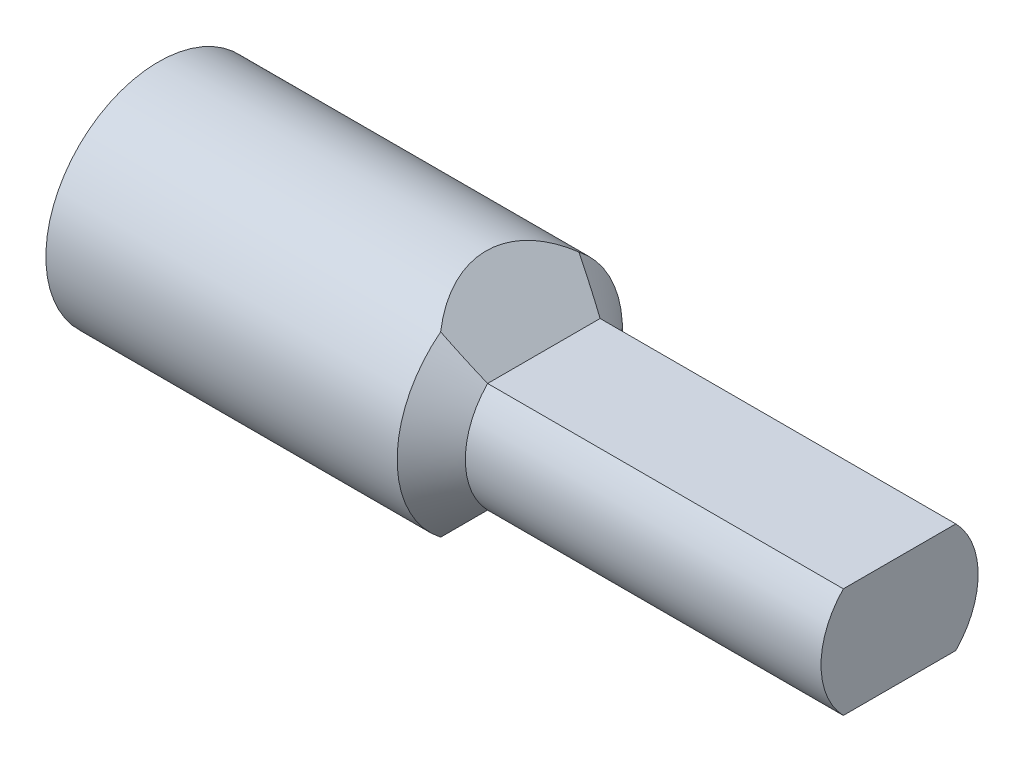
ISO-10303-21;
HEADER;
FILE_DESCRIPTION(('STEP AP214'),'2;1');
FILE_NAME('part.step','',(''),(''),'','','');
FILE_SCHEMA(('AUTOMOTIVE_DESIGN { 1 0 10303 214 1 1 1 1 }'));
ENDSEC;
DATA;
#1=APPLICATION_CONTEXT('core data for automotive mechanical design processes');
#2=APPLICATION_PROTOCOL_DEFINITION('international standard','automotive_design',2000,#1);
#3=PRODUCT_CONTEXT('',#1,'mechanical');
#4=PRODUCT('Part','Part','',(#3));
#5=PRODUCT_RELATED_PRODUCT_CATEGORY('part','',(#4));
#6=PRODUCT_DEFINITION_FORMATION('','',#4);
#7=PRODUCT_DEFINITION_CONTEXT('part definition',#1,'design');
#8=PRODUCT_DEFINITION('design','',#6,#7);
#9=PRODUCT_DEFINITION_SHAPE('','',#8);
#10=(LENGTH_UNIT() NAMED_UNIT(*) SI_UNIT(.MILLI.,.METRE.));
#11=(NAMED_UNIT(*) PLANE_ANGLE_UNIT() SI_UNIT($,.RADIAN.));
#12=(NAMED_UNIT(*) SI_UNIT($,.STERADIAN.) SOLID_ANGLE_UNIT());
#13=UNCERTAINTY_MEASURE_WITH_UNIT(LENGTH_MEASURE(1.E-05),#10,'distance_accuracy_value','');
#14=(GEOMETRIC_REPRESENTATION_CONTEXT(3) GLOBAL_UNCERTAINTY_ASSIGNED_CONTEXT((#13)) GLOBAL_UNIT_ASSIGNED_CONTEXT((#10,
#11,#12)) REPRESENTATION_CONTEXT('',''));
#15=CARTESIAN_POINT('',(0.,0.,0.));
#16=DIRECTION('',(0.,0.,1.));
#17=DIRECTION('',(1.,0.,0.));
#18=AXIS2_PLACEMENT_3D('',#15,#16,#17);
#19=CARTESIAN_POINT('',(2.,0.,0.));
#20=DIRECTION('',(-1.,0.,0.));
#21=DIRECTION('',(0.,0.,1.));
#22=AXIS2_PLACEMENT_3D('',#19,#20,#21);
#23=CYLINDRICAL_SURFACE('',#22,2.3);
#24=DIRECTION('',(-1.,0.,0.));
#25=VECTOR('',#24,1.);
#26=CARTESIAN_POINT('',(2.,1.54919333848297,-1.7));
#27=LINE('',#26,#25);
#28=CARTESIAN_POINT('',(-0.999999999999998,1.54919333848297,-1.7));
#29=VERTEX_POINT('',#28);
#30=CARTESIAN_POINT('',(-9.,1.54919333848297,-1.7));
#31=VERTEX_POINT('',#30);
#32=EDGE_CURVE('E114',#29,#31,#27,.T.);
#33=ORIENTED_EDGE('',*,*,#32,.F.);
#34=CARTESIAN_POINT('',(-0.999999999999998,0.,0.));
#35=DIRECTION('',(1.,0.,0.));
#36=DIRECTION('',(0.,0.,-1.));
#37=AXIS2_PLACEMENT_3D('',#34,#35,#36);
#38=CIRCLE('',#37,2.3);
#39=CARTESIAN_POINT('',(-0.999999999999998,-1.54919333848297,-1.7));
#40=VERTEX_POINT('',#39);
#41=EDGE_CURVE('E50',#29,#40,#38,.T.);
#42=ORIENTED_EDGE('',*,*,#41,.T.);
#43=DIRECTION('',(-1.,0.,0.));
#44=VECTOR('',#43,1.);
#45=CARTESIAN_POINT('',(2.,-1.54919333848297,-1.7));
#46=LINE('',#45,#44);
#47=CARTESIAN_POINT('',(-9.,-1.54919333848297,-1.7));
#48=VERTEX_POINT('',#47);
#49=EDGE_CURVE('E107',#40,#48,#46,.T.);
#50=ORIENTED_EDGE('',*,*,#49,.T.);
#51=CARTESIAN_POINT('',(-9.,0.,0.));
#52=DIRECTION('',(1.,0.,0.));
#53=DIRECTION('',(0.,0.,-1.));
#54=AXIS2_PLACEMENT_3D('',#51,#52,#53);
#55=CIRCLE('',#54,2.3);
#56=EDGE_CURVE('E110',#31,#48,#55,.T.);
#57=ORIENTED_EDGE('',*,*,#56,.F.);
#58=EDGE_LOOP('',(#33,#42,#50,#57));
#59=FACE_BOUND('',#58,.T.);
#60=ADVANCED_FACE('F35',(#59),#23,.F.);
#61=CARTESIAN_POINT('',(16.,0.,0.));
#62=DIRECTION('',(-1.,0.,0.));
#63=DIRECTION('',(0.,0.,1.));
#64=AXIS2_PLACEMENT_3D('',#61,#62,#63);
#65=CYLINDRICAL_SURFACE('',#64,2.65);
#66=DIRECTION('',(-1.,0.,0.));
#67=VECTOR('',#66,1.);
#68=CARTESIAN_POINT('',(16.,1.85,1.89736659610103));
#69=LINE('',#68,#67);
#70=CARTESIAN_POINT('',(16.,1.85,1.89736659610103));
#71=VERTEX_POINT('',#70);
#72=CARTESIAN_POINT('',(4.00000000000003,1.85,1.89736659610103));
#73=VERTEX_POINT('',#72);
#74=EDGE_CURVE('E140',#71,#73,#69,.T.);
#75=ORIENTED_EDGE('',*,*,#74,.T.);
#76=CARTESIAN_POINT('',(4.00000000000003,0.,0.));
#77=DIRECTION('',(1.,0.,0.));
#78=DIRECTION('',(0.,0.,-1.));
#79=AXIS2_PLACEMENT_3D('',#76,#77,#78);
#80=CIRCLE('',#79,2.65);
#81=CARTESIAN_POINT('',(4.00000000000003,-1.85,1.89736659610103));
#82=VERTEX_POINT('',#81);
#83=EDGE_CURVE('E157',#73,#82,#80,.T.);
#84=ORIENTED_EDGE('',*,*,#83,.T.);
#85=DIRECTION('',(-1.,0.,0.));
#86=VECTOR('',#85,1.);
#87=CARTESIAN_POINT('',(16.,-1.85,1.89736659610103));
#88=LINE('',#87,#86);
#89=CARTESIAN_POINT('',(16.,-1.85,1.89736659610103));
#90=VERTEX_POINT('',#89);
#91=EDGE_CURVE('E149',#90,#82,#88,.T.);
#92=ORIENTED_EDGE('',*,*,#91,.F.);
#93=CARTESIAN_POINT('',(16.,0.,0.));
#94=DIRECTION('',(1.,0.,0.));
#95=DIRECTION('',(0.,0.,-1.));
#96=AXIS2_PLACEMENT_3D('',#93,#94,#95);
#97=CIRCLE('',#96,2.65);
#98=EDGE_CURVE('E113',#71,#90,#97,.T.);
#99=ORIENTED_EDGE('',*,*,#98,.F.);
#100=EDGE_LOOP('',(#75,#84,#92,#99));
#101=FACE_BOUND('',#100,.T.);
#102=ADVANCED_FACE('F227',(#101),#65,.T.);
#103=CARTESIAN_POINT('',(16.,-1.85,1.89736659610103));
#104=DIRECTION('',(0.,1.,0.));
#105=DIRECTION('',(0.,0.,1.));
#106=AXIS2_PLACEMENT_3D('',#103,#104,#105);
#107=PLANE('',#106);
#108=ORIENTED_EDGE('',*,*,#91,.T.);
#109=DIRECTION('',(0.,0.,-1.));
#110=VECTOR('',#109,1.);
#111=CARTESIAN_POINT('',(4.00000000000003,-1.85,1.89736659610103));
#112=LINE('',#111,#110);
#113=CARTESIAN_POINT('',(4.00000000000003,-1.85,-1.89736659610103));
#114=VERTEX_POINT('',#113);
#115=EDGE_CURVE('E155',#82,#114,#112,.T.);
#116=ORIENTED_EDGE('',*,*,#115,.T.);
#117=DIRECTION('',(-1.,0.,0.));
#118=VECTOR('',#117,1.);
#119=CARTESIAN_POINT('',(16.,-1.85,-1.89736659610103));
#120=LINE('',#119,#118);
#121=CARTESIAN_POINT('',(16.,-1.85,-1.89736659610103));
#122=VERTEX_POINT('',#121);
#123=EDGE_CURVE('E146',#122,#114,#120,.T.);
#124=ORIENTED_EDGE('',*,*,#123,.F.);
#125=DIRECTION('',(0.,0.,-1.));
#126=VECTOR('',#125,1.);
#127=CARTESIAN_POINT('',(16.,-1.85,1.89736659610103));
#128=LINE('',#127,#126);
#129=EDGE_CURVE('E134',#90,#122,#128,.T.);
#130=ORIENTED_EDGE('',*,*,#129,.F.);
#131=EDGE_LOOP('',(#108,#116,#124,#130));
#132=FACE_BOUND('',#131,.T.);
#133=ADVANCED_FACE('F232',(#132),#107,.F.);
#134=CARTESIAN_POINT('',(16.,0.,0.));
#135=DIRECTION('',(-1.,0.,0.));
#136=DIRECTION('',(0.,0.,1.));
#137=AXIS2_PLACEMENT_3D('',#134,#135,#136);
#138=CYLINDRICAL_SURFACE('',#137,2.65);
#139=ORIENTED_EDGE('',*,*,#123,.T.);
#140=CARTESIAN_POINT('',(4.00000000000003,0.,0.));
#141=DIRECTION('',(1.,0.,0.));
#142=DIRECTION('',(0.,0.,-1.));
#143=AXIS2_PLACEMENT_3D('',#140,#141,#142);
#144=CIRCLE('',#143,2.65);
#145=CARTESIAN_POINT('',(4.00000000000003,1.85,-1.89736659610103));
#146=VERTEX_POINT('',#145);
#147=EDGE_CURVE('E152',#114,#146,#144,.T.);
#148=ORIENTED_EDGE('',*,*,#147,.T.);
#149=DIRECTION('',(-1.,0.,0.));
#150=VECTOR('',#149,1.);
#151=CARTESIAN_POINT('',(16.,1.85,-1.89736659610103));
#152=LINE('',#151,#150);
#153=CARTESIAN_POINT('',(16.,1.85,-1.89736659610103));
#154=VERTEX_POINT('',#153);
#155=EDGE_CURVE('E143',#154,#146,#152,.T.);
#156=ORIENTED_EDGE('',*,*,#155,.F.);
#157=CARTESIAN_POINT('',(16.,0.,0.));
#158=DIRECTION('',(1.,0.,0.));
#159=DIRECTION('',(0.,0.,-1.));
#160=AXIS2_PLACEMENT_3D('',#157,#158,#159);
#161=CIRCLE('',#160,2.65);
#162=EDGE_CURVE('E136',#122,#154,#161,.T.);
#163=ORIENTED_EDGE('',*,*,#162,.F.);
#164=EDGE_LOOP('',(#139,#148,#156,#163));
#165=FACE_BOUND('',#164,.T.);
#166=ADVANCED_FACE('F250',(#165),#138,.T.);
#167=CARTESIAN_POINT('',(16.,1.85,1.89736659610103));
#168=DIRECTION('',(0.,-1.,0.));
#169=DIRECTION('',(0.,0.,-1.));
#170=AXIS2_PLACEMENT_3D('',#167,#168,#169);
#171=PLANE('',#170);
#172=ORIENTED_EDGE('',*,*,#155,.T.);
#173=DIRECTION('',(0.,0.,1.));
#174=VECTOR('',#173,1.);
#175=CARTESIAN_POINT('',(4.00000000000003,1.85,1.89736659610103));
#176=LINE('',#175,#174);
#177=EDGE_CURVE('E159',#146,#73,#176,.T.);
#178=ORIENTED_EDGE('',*,*,#177,.T.);
#179=ORIENTED_EDGE('',*,*,#74,.F.);
#180=DIRECTION('',(0.,0.,1.));
#181=VECTOR('',#180,1.);
#182=CARTESIAN_POINT('',(16.,1.85,1.89736659610103));
#183=LINE('',#182,#181);
#184=EDGE_CURVE('E138',#154,#71,#183,.T.);
#185=ORIENTED_EDGE('',*,*,#184,.F.);
#186=EDGE_LOOP('',(#172,#178,#179,#185));
#187=FACE_BOUND('',#186,.T.);
#188=ADVANCED_FACE('F243',(#187),#171,.F.);
#189=CARTESIAN_POINT('',(16.,0.,0.));
#190=DIRECTION('',(1.,0.,0.));
#191=DIRECTION('',(0.,0.,-1.));
#192=AXIS2_PLACEMENT_3D('',#189,#190,#191);
#193=PLANE('',#192);
#194=ORIENTED_EDGE('',*,*,#98,.T.);
#195=ORIENTED_EDGE('',*,*,#129,.T.);
#196=ORIENTED_EDGE('',*,*,#162,.T.);
#197=ORIENTED_EDGE('',*,*,#184,.T.);
#198=EDGE_LOOP('',(#194,#195,#196,#197));
#199=FACE_BOUND('',#198,.T.);
#200=ADVANCED_FACE('F239',(#199),#193,.T.);
#201=CARTESIAN_POINT('',(0.,0.,0.));
#202=DIRECTION('',(1.,0.,0.));
#203=DIRECTION('',(0.,0.,-1.));
#204=AXIS2_PLACEMENT_3D('',#201,#202,#203);
#205=PLANE('',#204);
#206=CARTESIAN_POINT('',(0.,0.,0.));
#207=DIRECTION('',(1.,0.,0.));
#208=DIRECTION('',(0.,0.,-1.));
#209=AXIS2_PLACEMENT_3D('',#206,#207,#208);
#210=CIRCLE('',#209,1.29999999999999);
#211=CARTESIAN_POINT('',(0.,-0.875631017403411,-0.960869565217386));
#212=VERTEX_POINT('',#211);
#213=EDGE_CURVE('E55',#212,#212,#210,.F.);
#214=ORIENTED_EDGE('',*,*,#213,.T.);
#215=EDGE_LOOP('',(#214));
#216=FACE_BOUND('',#215,.T.);
#217=ADVANCED_FACE('F242',(#216),#205,.F.);
#218=CARTESIAN_POINT('',(2.,1.54919333848297,-1.7));
#219=DIRECTION('',(0.,0.,1.));
#220=DIRECTION('',(1.,0.,0.));
#221=AXIS2_PLACEMENT_3D('',#218,#219,#220);
#222=PLANE('',#221);
#223=ORIENTED_EDGE('',*,*,#49,.F.);
#224=CARTESIAN_POINT('',(-0.999999999999998,-1.54919333848297,-1.7));
#225=CARTESIAN_POINT('',(-0.974520977293433,-1.51136094456305,-1.7));
#226=CARTESIAN_POINT('',(-0.949387870382328,-1.47329595075994,-1.7));
#227=CARTESIAN_POINT('',(-0.899933936175087,-1.39662818421715,-1.7));
#228=CARTESIAN_POINT('',(-0.875613326454821,-1.35802527129011,-1.7));
#229=CARTESIAN_POINT('',(-0.803803962241551,-1.24089531646587,-1.7));
#230=CARTESIAN_POINT('',(-0.757756071547772,-1.16146952865761,-1.7));
#231=CARTESIAN_POINT('',(-0.669586365919587,-0.997116208388425,-1.7));
#232=CARTESIAN_POINT('',(-0.627639100669975,-0.912093850193668,-1.7));
#233=CARTESIAN_POINT('',(-0.551888646805159,-0.738612095282731,-1.7));
#234=CARTESIAN_POINT('',(-0.518066142944979,-0.65016144255061,-1.7));
#235=CARTESIAN_POINT('',(-0.473906899179682,-0.509003982034217,-1.7));
#236=CARTESIAN_POINT('',(-0.459754704015474,-0.457491146068599,-1.7));
#237=CARTESIAN_POINT('',(-0.435623707325159,-0.353477557879018,-1.7));
#238=CARTESIAN_POINT('',(-0.425645045813505,-0.30097677257289,-1.7));
#239=CARTESIAN_POINT('',(-0.410484455281287,-0.196000588030785,-1.7));
#240=CARTESIAN_POINT('',(-0.405239644535281,-0.143534397277221,-1.7));
#241=CARTESIAN_POINT('',(-0.39962136897463,-0.0383406189179161,-1.7));
#242=CARTESIAN_POINT('',(-0.399247561877825,0.0143869500604749,-1.7));
#243=CARTESIAN_POINT('',(-0.403392583518891,0.119627820769399,-1.7));
#244=CARTESIAN_POINT('',(-0.407909725176492,0.172141190115887,-1.7));
#245=CARTESIAN_POINT('',(-0.421570878566131,0.276564963933533,-1.7));
#246=CARTESIAN_POINT('',(-0.430716006530095,0.328475219847401,-1.7));
#247=CARTESIAN_POINT('',(-0.45333240412641,0.432178472358417,-1.7));
#248=CARTESIAN_POINT('',(-0.466868692285845,0.483957111387176,-1.7));
#249=CARTESIAN_POINT('',(-0.497625973142682,0.586380322897711,-1.7));
#250=CARTESIAN_POINT('',(-0.514846388549681,0.637025071684426,-1.7));
#251=CARTESIAN_POINT('',(-0.580414547710599,0.81205738896499,-1.7));
#252=CARTESIAN_POINT('',(-0.636796359574814,0.933447728375589,-1.7));
#253=CARTESIAN_POINT('',(-0.730159599562794,1.11088465057442,-1.7));
#254=CARTESIAN_POINT('',(-0.762825193304183,1.16937573375619,-1.7));
#255=CARTESIAN_POINT('',(-0.830494217626738,1.28499336648952,-1.7));
#256=CARTESIAN_POINT('',(-0.865497166522561,1.34212019391446,-1.7));
#257=CARTESIAN_POINT('',(-0.935409440232955,1.45215694577071,-1.7));
#258=CARTESIAN_POINT('',(-0.97022283554836,1.50512857164663,-1.7));
#259=CARTESIAN_POINT('',(-1.04118745466685,1.61017315772876,-1.7));
#260=CARTESIAN_POINT('',(-1.07733878113517,1.66224604851972,-1.7));
#261=CARTESIAN_POINT('',(-1.15041255614842,1.76517032959155,-1.7));
#262=CARTESIAN_POINT('',(-1.18732565863972,1.81602838292396,-1.7));
#263=CARTESIAN_POINT('',(-1.26203452211263,1.91707196994029,-1.7));
#264=CARTESIAN_POINT('',(-1.29983004730373,1.96725767776504,-1.7));
#265=CARTESIAN_POINT('',(-1.33798339668089,2.01716543723218,-1.7));
#266=B_SPLINE_CURVE_WITH_KNOTS('',3,(#224,#225,#226,#227,#228,#229,#230,#231,#232,#233,#234,
#235,#236,#237,#238,#239,#240,#241,#242,#243,#244,#245,#246,#247,#248,#249,#250,#251,#252,#253,
#254,#255,#256,#257,#258,#259,#260,#261,#262,#263,#264,#265),.UNSPECIFIED.,.F.,.F.,(4,2,2,2,2,2,
2,2,2,2,2,2,2,2,2,2,2,2,2,2,4),(0.,0.136832396488546,0.273701145842461,0.548971835667444,
0.833121644035026,1.11658909657102,1.2767105930548,1.43683746089237,1.5948045807902,
1.75276060038458,1.91066215209821,2.06860180652114,2.22899579460851,2.38936466787936,
2.78958913972749,2.9905637893885,3.19149714898217,3.38163932060344,3.57179611302847,
3.76031201162346,3.94877810106879),.UNSPECIFIED.);
#267=EDGE_CURVE('E11',#40,#29,#266,.T.);
#268=ORIENTED_EDGE('',*,*,#267,.T.);
#269=ORIENTED_EDGE('',*,*,#32,.T.);
#270=DIRECTION('',(0.,1.,0.));
#271=VECTOR('',#270,1.);
#272=CARTESIAN_POINT('',(-9.,1.54919333848297,-1.7));
#273=LINE('',#272,#271);
#274=EDGE_CURVE('E116',#48,#31,#273,.T.);
#275=ORIENTED_EDGE('',*,*,#274,.F.);
#276=EDGE_LOOP('',(#223,#268,#269,#275));
#277=FACE_BOUND('',#276,.T.);
#278=ADVANCED_FACE('F117',(#277),#222,.T.);
#279=CARTESIAN_POINT('',(2.,0.,0.));
#280=DIRECTION('',(-1.,0.,0.));
#281=DIRECTION('',(0.,0.,1.));
#282=AXIS2_PLACEMENT_3D('',#279,#280,#281);
#283=CYLINDRICAL_SURFACE('',#282,3.8);
#284=CARTESIAN_POINT('',(2.85000000000002,0.,0.));
#285=DIRECTION('',(-1.,0.,0.));
#286=DIRECTION('',(0.,0.,1.));
#287=AXIS2_PLACEMENT_3D('',#284,#285,#286);
#288=CIRCLE('',#287,3.8);
#289=CARTESIAN_POINT('',(2.85000000000002,-3.00000000000301,2.33238075793425));
#290=VERTEX_POINT('',#289);
#291=CARTESIAN_POINT('',(2.84999999999395,3.00000000000607,2.33238075793031));
#292=VERTEX_POINT('',#291);
#293=EDGE_CURVE('E166',#290,#292,#288,.T.);
#294=ORIENTED_EDGE('',*,*,#293,.T.);
#295=CARTESIAN_POINT('',(5.85000000000005,0.,0.));
#296=DIRECTION('',(-0.707106781186544,-0.707106781186551,0.));
#297=DIRECTION('',(-0.707106781186551,0.707106781186544,0.));
#298=AXIS2_PLACEMENT_3D('',#295,#296,#297);
#299=ELLIPSE('',#298,5.37401153701779,3.8);
#300=CARTESIAN_POINT('',(2.85000000000002,3.00000000000299,-2.33238075793428));
#301=VERTEX_POINT('',#300);
#302=EDGE_CURVE('E168',#292,#301,#299,.T.);
#303=ORIENTED_EDGE('',*,*,#302,.T.);
#304=CARTESIAN_POINT('',(2.85000000000002,0.,0.));
#305=DIRECTION('',(-1.,0.,0.));
#306=DIRECTION('',(0.,0.,1.));
#307=AXIS2_PLACEMENT_3D('',#304,#305,#306);
#308=CIRCLE('',#307,3.8);
#309=CARTESIAN_POINT('',(2.84999999999395,-3.00000000000607,-2.33238075793031));
#310=VERTEX_POINT('',#309);
#311=EDGE_CURVE('E161',#301,#310,#308,.T.);
#312=ORIENTED_EDGE('',*,*,#311,.T.);
#313=CARTESIAN_POINT('',(5.85000000000005,0.,0.));
#314=DIRECTION('',(-0.707106781186544,0.707106781186551,0.));
#315=DIRECTION('',(-0.707106781186551,-0.707106781186544,0.));
#316=AXIS2_PLACEMENT_3D('',#313,#314,#315);
#317=ELLIPSE('',#316,5.37401153701779,3.8);
#318=EDGE_CURVE('E164',#310,#290,#317,.T.);
#319=ORIENTED_EDGE('',*,*,#318,.T.);
#320=EDGE_LOOP('',(#294,#303,#312,#319));
#321=FACE_BOUND('',#320,.T.);
#322=CARTESIAN_POINT('',(-9.,0.,0.));
#323=DIRECTION('',(1.,0.,0.));
#324=DIRECTION('',(0.,0.,-1.));
#325=AXIS2_PLACEMENT_3D('',#322,#323,#324);
#326=CIRCLE('',#325,3.8);
#327=CARTESIAN_POINT('',(-9.,0.,-3.8));
#328=VERTEX_POINT('',#327);
#329=EDGE_CURVE('E119',#328,#328,#326,.T.);
#330=ORIENTED_EDGE('',*,*,#329,.T.);
#331=EDGE_LOOP('',(#330));
#332=FACE_BOUND('',#331,.T.);
#333=ADVANCED_FACE('F223',(#321,#332),#283,.T.);
#334=CARTESIAN_POINT('',(-9.,0.,0.));
#335=DIRECTION('',(1.,0.,0.));
#336=DIRECTION('',(0.,0.,-1.));
#337=AXIS2_PLACEMENT_3D('',#334,#335,#336);
#338=PLANE('',#337);
#339=ORIENTED_EDGE('',*,*,#274,.T.);
#340=ORIENTED_EDGE('',*,*,#56,.T.);
#341=EDGE_LOOP('',(#339,#340));
#342=FACE_BOUND('',#341,.T.);
#343=ORIENTED_EDGE('',*,*,#329,.F.);
#344=EDGE_LOOP('',(#343));
#345=FACE_BOUND('',#344,.T.);
#346=ADVANCED_FACE('F121',(#342,#345),#338,.F.);
#347=CARTESIAN_POINT('',(4.00000000000003,0.,0.));
#348=DIRECTION('',(-1.,0.,0.));
#349=DIRECTION('',(0.,0.,1.));
#350=AXIS2_PLACEMENT_3D('',#347,#348,#349);
#351=CONICAL_SURFACE('',#350,2.65,0.785398163397443);
#352=CARTESIAN_POINT('',(-4.91153301699797,10.7615330169979,4.22592626854714));
#353=CARTESIAN_POINT('',(-4.55081779517015,10.4008177951701,4.15761185207403));
#354=CARTESIAN_POINT('',(-4.19024796892505,10.040247968925,4.08772375748785));
#355=CARTESIAN_POINT('',(-3.46944608340027,9.31944608340022,3.94415155166097));
#356=CARTESIAN_POINT('',(-3.10921406613069,8.95921406613065,3.87046701924158));
#357=CARTESIAN_POINT('',(-2.38764354666603,8.237643546666,3.71833686549065));
#358=CARTESIAN_POINT('',(-2.02630707868424,7.87630707868421,3.63987186504859));
#359=CARTESIAN_POINT('',(-1.30426418083019,7.15426418083017,3.47755941518371));
#360=CARTESIAN_POINT('',(-0.943557705470605,6.79355770547059,3.39371237238774));
#361=CARTESIAN_POINT('',(-0.197405168471988,6.04740516847198,3.21318708841492));
#362=CARTESIAN_POINT('',(0.187982112190267,5.66201788780973,3.1160206121849));
#363=CARTESIAN_POINT('',(0.957552301137427,4.89244769886257,2.91177250887698));
#364=CARTESIAN_POINT('',(1.34173491477694,4.50826508522307,2.80468862609197));
#365=CARTESIAN_POINT('',(1.91608921030257,3.93391078969745,2.63390445648319));
#366=CARTESIAN_POINT('',(2.10702555360999,3.74297444639003,2.57534868790454));
#367=CARTESIAN_POINT('',(2.48823510288748,3.36176489711254,2.45408129075882));
#368=CARTESIAN_POINT('',(2.6785083300404,3.17149166995962,2.39136979624881));
#369=CARTESIAN_POINT('',(3.0581000699957,2.79189993000432,2.26081819659001));
#370=CARTESIAN_POINT('',(3.2474189171546,2.60258108284542,2.19298004323988));
#371=CARTESIAN_POINT('',(3.62480670371401,2.22519329628602,2.05070679791323));
#372=CARTESIAN_POINT('',(3.81287580039248,2.03712419960756,1.97627255361211));
#373=CARTESIAN_POINT('',(4.06572122719966,1.78427877280037,1.86965347095813));
#374=CARTESIAN_POINT('',(4.13132589805438,1.71867410194566,1.84138874441517));
#375=CARTESIAN_POINT('',(4.26225871268011,1.58774128731993,1.78359804910418));
#376=CARTESIAN_POINT('',(4.32758685021739,1.52241314978264,1.75407205206873));
#377=CARTESIAN_POINT('',(4.52316119592534,1.3268388040747,1.66331531503715));
#378=CARTESIAN_POINT('',(4.65291473839891,1.19708526160113,1.59994019411211));
#379=CARTESIAN_POINT('',(4.91025286007474,0.9397471399253,1.46565331321027));
#380=CARTESIAN_POINT('',(5.0378407625423,0.812159237457741,1.39475459812326));
#381=CARTESIAN_POINT('',(5.22665778295301,0.623342217047037,1.28014954924867));
#382=CARTESIAN_POINT('',(5.28914300322245,0.560856996777597,1.24059048344947));
#383=CARTESIAN_POINT('',(5.41295349323087,0.437046506769184,1.15801144576073));
#384=CARTESIAN_POINT('',(5.47427908135062,0.375720918649429,1.11499244136229));
#385=CARTESIAN_POINT('',(5.57264895002908,0.277351049970969,1.04142176279481));
#386=CARTESIAN_POINT('',(5.6101983501396,0.239801649860451,1.01222290917777));
#387=CARTESIAN_POINT('',(5.68445942880808,0.165540571191975,0.951725947657861));
#388=CARTESIAN_POINT('',(5.72117091228686,0.128829087713188,0.920427357454204));
#389=CARTESIAN_POINT('',(5.79323689472301,0.0567631052770428,0.855493544462531));
#390=CARTESIAN_POINT('',(5.82859837590247,0.0214016240975826,0.821873951876881));
#391=CARTESIAN_POINT('',(5.89774849920249,-0.0477484992024392,0.751558602157975));
#392=CARTESIAN_POINT('',(5.93153789427191,-0.0815378942718518,0.714864341720282));
#393=CARTESIAN_POINT('',(5.99397474269626,-0.143974742696205,0.641001060780356));
#394=CARTESIAN_POINT('',(6.02281271965286,-0.172812719652804,0.604160547392381));
#395=CARTESIAN_POINT('',(6.06406217206146,-0.214062172061404,0.545785002812706));
#396=CARTESIAN_POINT('',(6.07752045556352,-0.227520455563459,0.525732499180593));
#397=CARTESIAN_POINT('',(6.10356243957184,-0.253562439571781,0.484482690991334));
#398=CARTESIAN_POINT('',(6.11614507944137,-0.266145079441312,0.463284051519519));
#399=CARTESIAN_POINT('',(6.12819175534943,-0.278191755349376,0.441467089873071));
#400=B_SPLINE_CURVE_WITH_KNOTS('',3,(#352,#353,#354,#355,#356,#357,#358,#359,#360,#361,#362,
#363,#364,#365,#366,#367,#368,#369,#370,#371,#372,#373,#374,#375,#376,#377,#378,#379,#380,#381,
#382,#383,#384,#385,#386,#387,#388,#389,#390,#391,#392,#393,#394,#395,#396,#397,#398,#399),
.UNSPECIFIED.,.F.,.F.,(4,2,2,2,2,2,2,2,2,2,2,2,2,2,2,2,2,2,2,2,2,2,2,4),(0.,1.54405182168251,
3.08827531163395,4.63923966915365,6.19008698502552,7.85086674586135,9.51202518195162,
10.3409032659022,11.1697546245799,11.9982920011498,12.8267230548927,13.1176822446525,
13.4086479587721,13.9909445244924,14.5722474718822,14.8626493434683,15.1529702914028,
15.3347366053636,15.5165448141948,15.6972298191512,15.8778273751035,16.0424655857318,
16.1253604479547,16.2083540304674),.UNSPECIFIED.);
#401=EDGE_CURVE('E126',#292,#73,#400,.T.);
#402=ORIENTED_EDGE('',*,*,#401,.F.);
#403=ORIENTED_EDGE('',*,*,#293,.F.);
#404=CARTESIAN_POINT('',(-4.91153301699797,-10.7615330169979,4.22592626854714));
#405=CARTESIAN_POINT('',(-4.55081779517015,-10.4008177951701,4.15761185207404));
#406=CARTESIAN_POINT('',(-4.19024796892505,-10.040247968925,4.08772375748786));
#407=CARTESIAN_POINT('',(-3.46944608340027,-9.31944608340023,3.94415155166097));
#408=CARTESIAN_POINT('',(-3.10921406613069,-8.95921406613065,3.87046701924158));
#409=CARTESIAN_POINT('',(-2.38764354666604,-8.23764354666601,3.71833686549065));
#410=CARTESIAN_POINT('',(-2.02630707868424,-7.87630707868421,3.63987186504859));
#411=CARTESIAN_POINT('',(-1.30426418083019,-7.15426418083017,3.47755941518371));
#412=CARTESIAN_POINT('',(-0.943557705470608,-6.79355770547059,3.39371237238774));
#413=CARTESIAN_POINT('',(-0.197405168471991,-6.04740516847198,3.21318708841493));
#414=CARTESIAN_POINT('',(0.187982112190264,-5.66201788780973,3.1160206121849));
#415=CARTESIAN_POINT('',(0.957552301137424,-4.89244769886258,2.91177250887698));
#416=CARTESIAN_POINT('',(1.34173491477694,-4.50826508522307,2.80468862609197));
#417=CARTESIAN_POINT('',(1.91608921030256,-3.93391078969745,2.63390445648319));
#418=CARTESIAN_POINT('',(2.10702555360998,-3.74297444639003,2.57534868790454));
#419=CARTESIAN_POINT('',(2.48823510288748,-3.36176489711254,2.45408129075882));
#420=CARTESIAN_POINT('',(2.6785083300404,-3.17149166995962,2.39136979624881));
#421=CARTESIAN_POINT('',(3.0581000699957,-2.79189993000433,2.26081819659001));
#422=CARTESIAN_POINT('',(3.2474189171546,-2.60258108284543,2.19298004323988));
#423=CARTESIAN_POINT('',(3.62480670371401,-2.22519329628602,2.05070679791324));
#424=CARTESIAN_POINT('',(3.81287580039247,-2.03712419960756,1.97627255361211));
#425=CARTESIAN_POINT('',(4.06572122719966,-1.78427877280038,1.86965347095813));
#426=CARTESIAN_POINT('',(4.13132589805437,-1.71867410194566,1.84138874441517));
#427=CARTESIAN_POINT('',(4.2622587126801,-1.58774128731993,1.78359804910418));
#428=CARTESIAN_POINT('',(4.32758685021739,-1.52241314978265,1.75407205206873));
#429=CARTESIAN_POINT('',(4.52316119592534,-1.3268388040747,1.66331531503715));
#430=CARTESIAN_POINT('',(4.65291473839891,-1.19708526160113,1.59994019411211));
#431=CARTESIAN_POINT('',(4.91025286007474,-0.939747139925302,1.46565331321027));
#432=CARTESIAN_POINT('',(5.0378407625423,-0.812159237457744,1.39475459812326));
#433=CARTESIAN_POINT('',(5.22665778295301,-0.62334221704704,1.28014954924867));
#434=CARTESIAN_POINT('',(5.28914300322245,-0.560856996777599,1.24059048344947));
#435=CARTESIAN_POINT('',(5.41295349323086,-0.437046506769185,1.15801144576073));
#436=CARTESIAN_POINT('',(5.47427908135062,-0.37572091864943,1.11499244136229));
#437=CARTESIAN_POINT('',(5.57264895002908,-0.277351049970969,1.04142176279481));
#438=CARTESIAN_POINT('',(5.6101983501396,-0.239801649860451,1.01222290917777));
#439=CARTESIAN_POINT('',(5.68445942880808,-0.165540571191975,0.951725947657861));
#440=CARTESIAN_POINT('',(5.72117091228686,-0.128829087713188,0.920427357454204));
#441=CARTESIAN_POINT('',(5.79323689472301,-0.0567631052770428,0.855493544462531));
#442=CARTESIAN_POINT('',(5.82859837590247,-0.0214016240975826,0.821873951876881));
#443=CARTESIAN_POINT('',(5.89774849920249,0.0477484992024392,0.751558602157975));
#444=CARTESIAN_POINT('',(5.93153789427191,0.0815378942718518,0.714864341720282));
#445=CARTESIAN_POINT('',(5.99397474269626,0.143974742696205,0.641001060780356));
#446=CARTESIAN_POINT('',(6.02281271965286,0.172812719652804,0.604160547392381));
#447=CARTESIAN_POINT('',(6.06406217206146,0.214062172061404,0.545785002812706));
#448=CARTESIAN_POINT('',(6.07752045556352,0.227520455563459,0.525732499180593));
#449=CARTESIAN_POINT('',(6.10356243957184,0.253562439571781,0.484482690991334));
#450=CARTESIAN_POINT('',(6.11614507944137,0.266145079441312,0.463284051519519));
#451=CARTESIAN_POINT('',(6.12819175534943,0.278191755349376,0.441467089873071));
#452=B_SPLINE_CURVE_WITH_KNOTS('',3,(#404,#405,#406,#407,#408,#409,#410,#411,#412,#413,#414,
#415,#416,#417,#418,#419,#420,#421,#422,#423,#424,#425,#426,#427,#428,#429,#430,#431,#432,#433,
#434,#435,#436,#437,#438,#439,#440,#441,#442,#443,#444,#445,#446,#447,#448,#449,#450,#451),
.UNSPECIFIED.,.F.,.F.,(4,2,2,2,2,2,2,2,2,2,2,2,2,2,2,2,2,2,2,2,2,2,2,4),(0.,1.54405182168251,
3.08827531163395,4.63923966915366,6.19008698502552,7.85086674586135,9.51202518195162,
10.3409032659022,11.1697546245799,11.9982920011498,12.8267230548927,13.1176822446525,
13.4086479587721,13.9909445244924,14.5722474718822,14.8626493434683,15.1529702914028,
15.3347366053636,15.5165448141948,15.6972298191512,15.8778273751035,16.0424655857318,
16.1253604479547,16.2083540304674),.UNSPECIFIED.);
#453=EDGE_CURVE('E123',#82,#290,#452,.F.);
#454=ORIENTED_EDGE('',*,*,#453,.F.);
#455=ORIENTED_EDGE('',*,*,#83,.F.);
#456=EDGE_LOOP('',(#402,#403,#454,#455));
#457=FACE_BOUND('',#456,.T.);
#458=ADVANCED_FACE('F211',(#457),#351,.T.);
#459=CARTESIAN_POINT('',(4.00000000000003,-1.85,1.89736659610103));
#460=DIRECTION('',(-0.707106781186544,0.707106781186551,0.));
#461=DIRECTION('',(0.,0.,-1.));
#462=AXIS2_PLACEMENT_3D('',#459,#460,#461);
#463=PLANE('',#462);
#464=ORIENTED_EDGE('',*,*,#453,.T.);
#465=ORIENTED_EDGE('',*,*,#318,.F.);
#466=CARTESIAN_POINT('',(-4.91153301699797,-10.7615330169979,-4.22592626854714));
#467=CARTESIAN_POINT('',(-4.55081779517015,-10.4008177951701,-4.15761185207404));
#468=CARTESIAN_POINT('',(-4.19024796892504,-10.040247968925,-4.08772375748785));
#469=CARTESIAN_POINT('',(-3.46944608340026,-9.31944608340022,-3.94415155166096));
#470=CARTESIAN_POINT('',(-3.10921406613068,-8.95921406613064,-3.87046701924158));
#471=CARTESIAN_POINT('',(-2.38764354666603,-8.23764354666599,-3.71833686549065));
#472=CARTESIAN_POINT('',(-2.02630707868423,-7.8763070786842,-3.63987186504858));
#473=CARTESIAN_POINT('',(-1.30426418083018,-7.15426418083015,-3.47755941518371));
#474=CARTESIAN_POINT('',(-0.943557705470594,-6.79355770547058,-3.39371237238774));
#475=CARTESIAN_POINT('',(-0.197405168471978,-6.04740516847197,-3.21318708841493));
#476=CARTESIAN_POINT('',(0.187982112190276,-5.66201788780972,-3.11602061218489));
#477=CARTESIAN_POINT('',(0.957552301137434,-4.89244769886257,-2.91177250887697));
#478=CARTESIAN_POINT('',(1.34173491477695,-4.50826508522306,-2.80468862609197));
#479=CARTESIAN_POINT('',(1.91608921030257,-3.93391078969744,-2.63390445648319));
#480=CARTESIAN_POINT('',(2.10702555360999,-3.74297444639002,-2.57534868790453));
#481=CARTESIAN_POINT('',(2.48823510288749,-3.36176489711253,-2.45408129075882));
#482=CARTESIAN_POINT('',(2.6785083300404,-3.17149166995962,-2.39136979624881));
#483=CARTESIAN_POINT('',(3.05810006999571,-2.79189993000432,-2.26081819659001));
#484=CARTESIAN_POINT('',(3.24741891715461,-2.60258108284542,-2.19298004323988));
#485=CARTESIAN_POINT('',(3.62480670371402,-2.22519329628602,-2.05070679791323));
#486=CARTESIAN_POINT('',(3.81287580039248,-2.03712419960756,-1.97627255361211));
#487=CARTESIAN_POINT('',(4.06572122719966,-1.78427877280037,-1.86965347095813));
#488=CARTESIAN_POINT('',(4.13132589805438,-1.71867410194566,-1.84138874441517));
#489=CARTESIAN_POINT('',(4.26225871268011,-1.58774128731993,-1.78359804910418));
#490=CARTESIAN_POINT('',(4.32758685021739,-1.52241314978264,-1.75407205206873));
#491=CARTESIAN_POINT('',(4.52316119592534,-1.3268388040747,-1.66331531503715));
#492=CARTESIAN_POINT('',(4.65291473839891,-1.19708526160113,-1.59994019411211));
#493=CARTESIAN_POINT('',(4.91025286007474,-0.939747139925301,-1.46565331321027));
#494=CARTESIAN_POINT('',(5.0378407625423,-0.812159237457743,-1.39475459812326));
#495=CARTESIAN_POINT('',(5.22665778295301,-0.62334221704704,-1.28014954924867));
#496=CARTESIAN_POINT('',(5.28914300322245,-0.5608569967776,-1.24059048344947));
#497=CARTESIAN_POINT('',(5.41295349323086,-0.437046506769187,-1.15801144576073));
#498=CARTESIAN_POINT('',(5.47427908135062,-0.375720918649432,-1.11499244136229));
#499=CARTESIAN_POINT('',(5.57264895002908,-0.277351049970972,-1.04142176279481));
#500=CARTESIAN_POINT('',(5.6101983501396,-0.239801649860453,-1.01222290917777));
#501=CARTESIAN_POINT('',(5.68445942880808,-0.165540571191976,-0.951725947657862));
#502=CARTESIAN_POINT('',(5.72117091228686,-0.128829087713189,-0.920427357454205));
#503=CARTESIAN_POINT('',(5.79323689472301,-0.0567631052770428,-0.855493544462531));
#504=CARTESIAN_POINT('',(5.82859837590247,-0.0214016240975824,-0.82187395187688));
#505=CARTESIAN_POINT('',(5.89774849920249,0.0477484992024402,-0.751558602157974));
#506=CARTESIAN_POINT('',(5.93153789427191,0.0815378942718532,-0.71486434172028));
#507=CARTESIAN_POINT('',(5.99397474269626,0.143974742696207,-0.641001060780354));
#508=CARTESIAN_POINT('',(6.02281271965286,0.172812719652805,-0.604160547392381));
#509=CARTESIAN_POINT('',(6.06406217206146,0.214062172061404,-0.545785002812706));
#510=CARTESIAN_POINT('',(6.07752045556352,0.227520455563458,-0.525732499180594));
#511=CARTESIAN_POINT('',(6.10356243957184,0.253562439571779,-0.484482690991336));
#512=CARTESIAN_POINT('',(6.11614507944137,0.26614507944131,-0.46328405151952));
#513=CARTESIAN_POINT('',(6.12819175534943,0.278191755349375,-0.441467089873072));
#514=B_SPLINE_CURVE_WITH_KNOTS('',3,(#466,#467,#468,#469,#470,#471,#472,#473,#474,#475,#476,
#477,#478,#479,#480,#481,#482,#483,#484,#485,#486,#487,#488,#489,#490,#491,#492,#493,#494,#495,
#496,#497,#498,#499,#500,#501,#502,#503,#504,#505,#506,#507,#508,#509,#510,#511,#512,#513),
.UNSPECIFIED.,.F.,.F.,(4,2,2,2,2,2,2,2,2,2,2,2,2,2,2,2,2,2,2,2,2,2,2,4),(0.,1.54405182168252,
3.08827531163395,4.63923966915367,6.19008698502553,7.85086674586136,9.51202518195163,
10.3409032659022,11.1697546245799,11.9982920011498,12.8267230548927,13.1176822446525,
13.4086479587721,13.9909445244924,14.5722474718822,14.8626493434683,15.1529702914028,
15.3347366053636,15.5165448141948,15.6972298191512,15.8778273751035,16.0424655857318,
16.1253604479547,16.2083540304674),.UNSPECIFIED.);
#515=EDGE_CURVE('E178',#114,#310,#514,.F.);
#516=ORIENTED_EDGE('',*,*,#515,.F.);
#517=ORIENTED_EDGE('',*,*,#115,.F.);
#518=EDGE_LOOP('',(#464,#465,#516,#517));
#519=FACE_BOUND('',#518,.T.);
#520=ADVANCED_FACE('F196',(#519),#463,.F.);
#521=CARTESIAN_POINT('',(4.00000000000003,1.85,1.89736659610103));
#522=DIRECTION('',(-0.707106781186544,-0.707106781186551,0.));
#523=DIRECTION('',(0.,0.,1.));
#524=AXIS2_PLACEMENT_3D('',#521,#522,#523);
#525=PLANE('',#524);
#526=ORIENTED_EDGE('',*,*,#401,.T.);
#527=ORIENTED_EDGE('',*,*,#177,.F.);
#528=CARTESIAN_POINT('',(-4.91153301699797,10.7615330169979,-4.22592626854714));
#529=CARTESIAN_POINT('',(-4.55081779517015,10.4008177951701,-4.15761185207403));
#530=CARTESIAN_POINT('',(-4.19024796892505,10.040247968925,-4.08772375748785));
#531=CARTESIAN_POINT('',(-3.46944608340027,9.31944608340022,-3.94415155166097));
#532=CARTESIAN_POINT('',(-3.10921406613069,8.95921406613065,-3.87046701924158));
#533=CARTESIAN_POINT('',(-2.38764354666603,8.237643546666,-3.71833686549065));
#534=CARTESIAN_POINT('',(-2.02630707868424,7.87630707868421,-3.63987186504859));
#535=CARTESIAN_POINT('',(-1.30426418083019,7.15426418083017,-3.47755941518371));
#536=CARTESIAN_POINT('',(-0.943557705470605,6.79355770547059,-3.39371237238774));
#537=CARTESIAN_POINT('',(-0.197405168471988,6.04740516847198,-3.21318708841492));
#538=CARTESIAN_POINT('',(0.187982112190267,5.66201788780973,-3.1160206121849));
#539=CARTESIAN_POINT('',(0.957552301137427,4.89244769886257,-2.91177250887698));
#540=CARTESIAN_POINT('',(1.34173491477694,4.50826508522307,-2.80468862609197));
#541=CARTESIAN_POINT('',(1.91608921030257,3.93391078969745,-2.63390445648319));
#542=CARTESIAN_POINT('',(2.10702555360999,3.74297444639003,-2.57534868790454));
#543=CARTESIAN_POINT('',(2.48823510288748,3.36176489711254,-2.45408129075882));
#544=CARTESIAN_POINT('',(2.6785083300404,3.17149166995962,-2.39136979624881));
#545=CARTESIAN_POINT('',(3.0581000699957,2.79189993000432,-2.26081819659001));
#546=CARTESIAN_POINT('',(3.2474189171546,2.60258108284542,-2.19298004323988));
#547=CARTESIAN_POINT('',(3.62480670371401,2.22519329628602,-2.05070679791323));
#548=CARTESIAN_POINT('',(3.81287580039248,2.03712419960756,-1.97627255361211));
#549=CARTESIAN_POINT('',(4.06572122719966,1.78427877280037,-1.86965347095813));
#550=CARTESIAN_POINT('',(4.13132589805438,1.71867410194566,-1.84138874441517));
#551=CARTESIAN_POINT('',(4.26225871268011,1.58774128731993,-1.78359804910418));
#552=CARTESIAN_POINT('',(4.32758685021739,1.52241314978264,-1.75407205206873));
#553=CARTESIAN_POINT('',(4.52316119592534,1.3268388040747,-1.66331531503715));
#554=CARTESIAN_POINT('',(4.65291473839891,1.19708526160113,-1.59994019411211));
#555=CARTESIAN_POINT('',(4.91025286007474,0.9397471399253,-1.46565331321027));
#556=CARTESIAN_POINT('',(5.0378407625423,0.812159237457741,-1.39475459812326));
#557=CARTESIAN_POINT('',(5.22665778295301,0.623342217047037,-1.28014954924867));
#558=CARTESIAN_POINT('',(5.28914300322245,0.560856996777597,-1.24059048344947));
#559=CARTESIAN_POINT('',(5.41295349323087,0.437046506769184,-1.15801144576073));
#560=CARTESIAN_POINT('',(5.47427908135062,0.375720918649429,-1.11499244136229));
#561=CARTESIAN_POINT('',(5.57264895002908,0.277351049970969,-1.04142176279481));
#562=CARTESIAN_POINT('',(5.6101983501396,0.239801649860451,-1.01222290917777));
#563=CARTESIAN_POINT('',(5.68445942880808,0.165540571191975,-0.951725947657861));
#564=CARTESIAN_POINT('',(5.72117091228686,0.128829087713188,-0.920427357454204));
#565=CARTESIAN_POINT('',(5.79323689472301,0.0567631052770428,-0.855493544462531));
#566=CARTESIAN_POINT('',(5.82859837590247,0.0214016240975826,-0.821873951876881));
#567=CARTESIAN_POINT('',(5.89774849920249,-0.0477484992024392,-0.751558602157975));
#568=CARTESIAN_POINT('',(5.93153789427191,-0.0815378942718518,-0.714864341720282));
#569=CARTESIAN_POINT('',(5.99397474269626,-0.143974742696205,-0.641001060780356));
#570=CARTESIAN_POINT('',(6.02281271965286,-0.172812719652804,-0.604160547392381));
#571=CARTESIAN_POINT('',(6.06406217206146,-0.214062172061404,-0.545785002812706));
#572=CARTESIAN_POINT('',(6.07752045556352,-0.227520455563459,-0.525732499180593));
#573=CARTESIAN_POINT('',(6.10356243957184,-0.253562439571781,-0.484482690991334));
#574=CARTESIAN_POINT('',(6.11614507944137,-0.266145079441312,-0.463284051519519));
#575=CARTESIAN_POINT('',(6.12819175534943,-0.278191755349376,-0.441467089873071));
#576=B_SPLINE_CURVE_WITH_KNOTS('',3,(#528,#529,#530,#531,#532,#533,#534,#535,#536,#537,#538,
#539,#540,#541,#542,#543,#544,#545,#546,#547,#548,#549,#550,#551,#552,#553,#554,#555,#556,#557,
#558,#559,#560,#561,#562,#563,#564,#565,#566,#567,#568,#569,#570,#571,#572,#573,#574,#575),
.UNSPECIFIED.,.F.,.F.,(4,2,2,2,2,2,2,2,2,2,2,2,2,2,2,2,2,2,2,2,2,2,2,4),(0.,1.54405182168251,
3.08827531163395,4.63923966915365,6.19008698502552,7.85086674586135,9.51202518195162,
10.3409032659022,11.1697546245799,11.9982920011498,12.8267230548927,13.1176822446525,
13.4086479587721,13.9909445244924,14.5722474718822,14.8626493434683,15.1529702914028,
15.3347366053636,15.5165448141948,15.6972298191512,15.8778273751035,16.0424655857318,
16.1253604479547,16.2083540304674),.UNSPECIFIED.);
#577=EDGE_CURVE('E170',#301,#146,#576,.T.);
#578=ORIENTED_EDGE('',*,*,#577,.F.);
#579=ORIENTED_EDGE('',*,*,#302,.F.);
#580=EDGE_LOOP('',(#526,#527,#578,#579));
#581=FACE_BOUND('',#580,.T.);
#582=ADVANCED_FACE('F190',(#581),#525,.F.);
#583=CARTESIAN_POINT('',(4.00000000000003,0.,0.));
#584=DIRECTION('',(-1.,0.,0.));
#585=DIRECTION('',(0.,0.,1.));
#586=AXIS2_PLACEMENT_3D('',#583,#584,#585);
#587=CONICAL_SURFACE('',#586,2.65,0.785398163397443);
#588=ORIENTED_EDGE('',*,*,#515,.T.);
#589=ORIENTED_EDGE('',*,*,#311,.F.);
#590=ORIENTED_EDGE('',*,*,#577,.T.);
#591=ORIENTED_EDGE('',*,*,#147,.F.);
#592=EDGE_LOOP('',(#588,#589,#590,#591));
#593=FACE_BOUND('',#592,.T.);
#594=ADVANCED_FACE('F186',(#593),#587,.T.);
#595=CARTESIAN_POINT('',(0.,0.,0.));
#596=DIRECTION('',(-1.,0.,0.));
#597=DIRECTION('',(0.,0.,1.));
#598=AXIS2_PLACEMENT_3D('',#595,#596,#597);
#599=CONICAL_SURFACE('',#598,1.29999999999999,0.785398163397453);
#600=ORIENTED_EDGE('',*,*,#267,.F.);
#601=ORIENTED_EDGE('',*,*,#41,.F.);
#602=EDGE_LOOP('',(#600,#601));
#603=FACE_BOUND('',#602,.T.);
#604=ORIENTED_EDGE('',*,*,#213,.F.);
#605=EDGE_LOOP('',(#604));
#606=FACE_BOUND('',#605,.T.);
#607=ADVANCED_FACE('F38',(#603,#606),#599,.F.);
#608=CLOSED_SHELL('',(#60,#102,#133,#166,#188,#200,#217,#278,#333,#346,#458,#520,#582,#594,#607));
#609=MANIFOLD_SOLID_BREP('B2',#608);
#610=ADVANCED_BREP_SHAPE_REPRESENTATION('',(#18,#609),#14);
#611=SHAPE_DEFINITION_REPRESENTATION(#9,#610);
ENDSEC;
END-ISO-10303-21;
